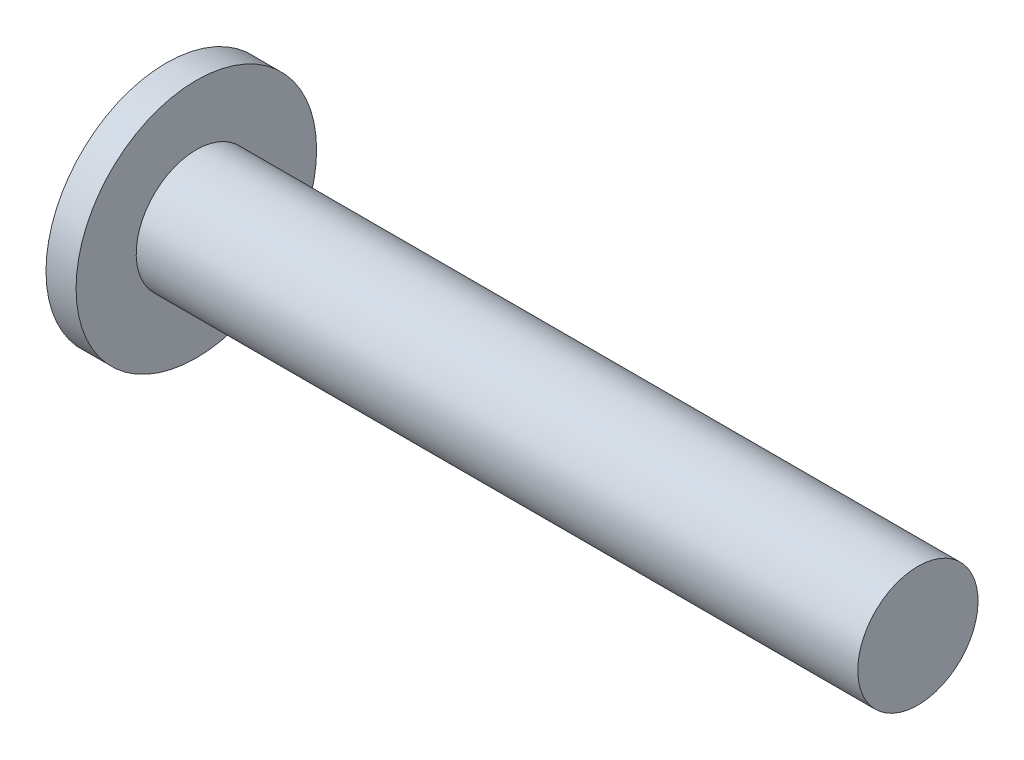
ISO-10303-21;
HEADER;
FILE_DESCRIPTION(('STEP AP214'),'2;1');
FILE_NAME('part.step','',(''),(''),'','','');
FILE_SCHEMA(('AUTOMOTIVE_DESIGN { 1 0 10303 214 1 1 1 1 }'));
ENDSEC;
DATA;
#1=APPLICATION_CONTEXT('core data for automotive mechanical design processes');
#2=APPLICATION_PROTOCOL_DEFINITION('international standard','automotive_design',2000,#1);
#3=PRODUCT_CONTEXT('',#1,'mechanical');
#4=PRODUCT('Part','Part','',(#3));
#5=PRODUCT_RELATED_PRODUCT_CATEGORY('part','',(#4));
#6=PRODUCT_DEFINITION_FORMATION('','',#4);
#7=PRODUCT_DEFINITION_CONTEXT('part definition',#1,'design');
#8=PRODUCT_DEFINITION('design','',#6,#7);
#9=PRODUCT_DEFINITION_SHAPE('','',#8);
#10=(LENGTH_UNIT() NAMED_UNIT(*) SI_UNIT(.MILLI.,.METRE.));
#11=(NAMED_UNIT(*) PLANE_ANGLE_UNIT() SI_UNIT($,.RADIAN.));
#12=(NAMED_UNIT(*) SI_UNIT($,.STERADIAN.) SOLID_ANGLE_UNIT());
#13=UNCERTAINTY_MEASURE_WITH_UNIT(LENGTH_MEASURE(1.E-05),#10,'distance_accuracy_value','');
#14=(GEOMETRIC_REPRESENTATION_CONTEXT(3) GLOBAL_UNCERTAINTY_ASSIGNED_CONTEXT((#13)) GLOBAL_UNIT_ASSIGNED_CONTEXT((#10,
#11,#12)) REPRESENTATION_CONTEXT('',''));
#15=CARTESIAN_POINT('',(0.,0.,0.));
#16=DIRECTION('',(0.,0.,1.));
#17=DIRECTION('',(1.,0.,0.));
#18=AXIS2_PLACEMENT_3D('',#15,#16,#17);
#19=CARTESIAN_POINT('',(72.8928571428571,0.,0.));
#20=DIRECTION('',(-1.,0.,0.));
#21=DIRECTION('',(0.,-1.,0.));
#22=AXIS2_PLACEMENT_3D('',#19,#20,#21);
#23=PLANE('',#22);
#24=CARTESIAN_POINT('',(72.8928571428571,0.,0.));
#25=DIRECTION('',(1.,0.,0.));
#26=DIRECTION('',(0.,1.,0.));
#27=AXIS2_PLACEMENT_3D('',#24,#25,#26);
#28=CIRCLE('',#27,14.);
#29=CARTESIAN_POINT('',(72.8928571428571,14.,0.));
#30=VERTEX_POINT('',#29);
#31=EDGE_CURVE('E10',#30,#30,#28,.T.);
#32=ORIENTED_EDGE('',*,*,#31,.F.);
#33=EDGE_LOOP('',(#32));
#34=FACE_BOUND('',#33,.T.);
#35=ADVANCED_FACE('F38',(#34),#23,.T.);
#36=CARTESIAN_POINT('',(160.392857142857,0.,0.));
#37=DIRECTION('',(1.,0.,0.));
#38=DIRECTION('',(0.,1.,0.));
#39=AXIS2_PLACEMENT_3D('',#36,#37,#38);
#40=CYLINDRICAL_SURFACE('',#39,14.);
#41=ORIENTED_EDGE('',*,*,#31,.T.);
#42=EDGE_LOOP('',(#41));
#43=FACE_BOUND('',#42,.T.);
#44=CARTESIAN_POINT('',(76.3928571428571,0.,0.));
#45=DIRECTION('',(1.,0.,0.));
#46=DIRECTION('',(0.,1.,0.));
#47=AXIS2_PLACEMENT_3D('',#44,#45,#46);
#48=CIRCLE('',#47,14.);
#49=CARTESIAN_POINT('',(76.3928571428571,14.,0.));
#50=VERTEX_POINT('',#49);
#51=EDGE_CURVE('E45',#50,#50,#48,.T.);
#52=ORIENTED_EDGE('',*,*,#51,.F.);
#53=EDGE_LOOP('',(#52));
#54=FACE_BOUND('',#53,.T.);
#55=ADVANCED_FACE('F74',(#43,#54),#40,.T.);
#56=CARTESIAN_POINT('',(76.3928571428571,14.,0.));
#57=DIRECTION('',(1.,0.,0.));
#58=DIRECTION('',(0.,1.,0.));
#59=AXIS2_PLACEMENT_3D('',#56,#57,#58);
#60=PLANE('',#59);
#61=ORIENTED_EDGE('',*,*,#51,.T.);
#62=EDGE_LOOP('',(#61));
#63=FACE_BOUND('',#62,.T.);
#64=CARTESIAN_POINT('',(76.3928571428571,0.,0.));
#65=DIRECTION('',(1.,0.,0.));
#66=DIRECTION('',(0.,1.,0.));
#67=AXIS2_PLACEMENT_3D('',#64,#65,#66);
#68=CIRCLE('',#67,6.99999999999999);
#69=CARTESIAN_POINT('',(76.3928571428571,6.99999999999999,0.));
#70=VERTEX_POINT('',#69);
#71=EDGE_CURVE('E50',#70,#70,#68,.T.);
#72=ORIENTED_EDGE('',*,*,#71,.F.);
#73=EDGE_LOOP('',(#72));
#74=FACE_BOUND('',#73,.T.);
#75=ADVANCED_FACE('F66',(#63,#74),#60,.T.);
#76=CARTESIAN_POINT('',(160.392857142857,0.,0.));
#77=DIRECTION('',(1.,0.,0.));
#78=DIRECTION('',(0.,1.,0.));
#79=AXIS2_PLACEMENT_3D('',#76,#77,#78);
#80=CYLINDRICAL_SURFACE('',#79,6.99999999999999);
#81=ORIENTED_EDGE('',*,*,#71,.T.);
#82=EDGE_LOOP('',(#81));
#83=FACE_BOUND('',#82,.T.);
#84=CARTESIAN_POINT('',(160.392857142857,0.,0.));
#85=DIRECTION('',(1.,0.,0.));
#86=DIRECTION('',(0.,1.,0.));
#87=AXIS2_PLACEMENT_3D('',#84,#85,#86);
#88=CIRCLE('',#87,6.99999999999999);
#89=CARTESIAN_POINT('',(160.392857142857,6.99999999999998,0.));
#90=VERTEX_POINT('',#89);
#91=EDGE_CURVE('E55',#90,#90,#88,.T.);
#92=ORIENTED_EDGE('',*,*,#91,.F.);
#93=EDGE_LOOP('',(#92));
#94=FACE_BOUND('',#93,.T.);
#95=ADVANCED_FACE('F64',(#83,#94),#80,.T.);
#96=CARTESIAN_POINT('',(160.392857142857,6.99999999999998,0.));
#97=DIRECTION('',(1.,0.,0.));
#98=DIRECTION('',(0.,1.,0.));
#99=AXIS2_PLACEMENT_3D('',#96,#97,#98);
#100=PLANE('',#99);
#101=ORIENTED_EDGE('',*,*,#91,.T.);
#102=EDGE_LOOP('',(#101));
#103=FACE_BOUND('',#102,.T.);
#104=ADVANCED_FACE('F62',(#103),#100,.T.);
#105=CLOSED_SHELL('',(#35,#55,#75,#95,#104));
#106=MANIFOLD_SOLID_BREP('B2',#105);
#107=ADVANCED_BREP_SHAPE_REPRESENTATION('',(#18,#106),#14);
#108=SHAPE_DEFINITION_REPRESENTATION(#9,#107);
ENDSEC;
END-ISO-10303-21;
